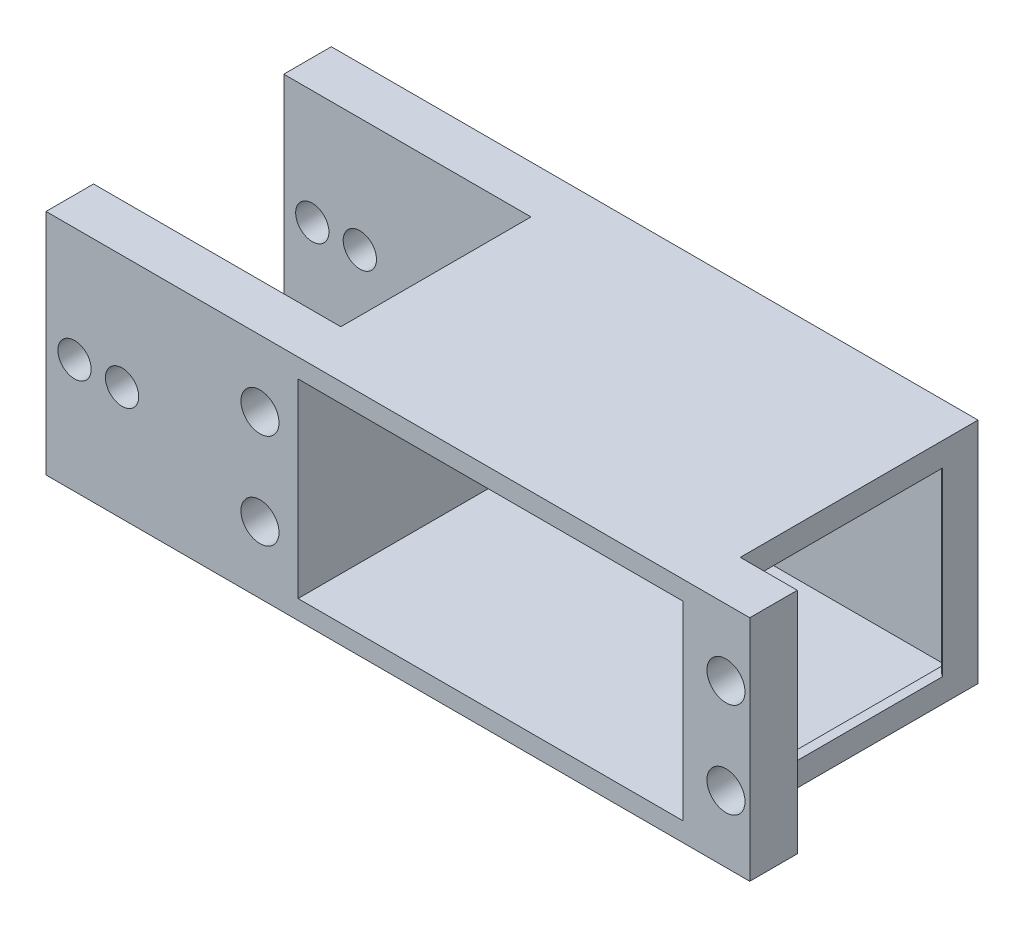
ISO-10303-21;
HEADER;
FILE_DESCRIPTION(('STEP AP214'),'2;1');
FILE_NAME('part.step','',(''),(''),'','','');
FILE_SCHEMA(('AUTOMOTIVE_DESIGN { 1 0 10303 214 1 1 1 1 }'));
ENDSEC;
DATA;
#1=APPLICATION_CONTEXT('core data for automotive mechanical design processes');
#2=APPLICATION_PROTOCOL_DEFINITION('international standard','automotive_design',2000,#1);
#3=PRODUCT_CONTEXT('',#1,'mechanical');
#4=PRODUCT('Part','Part','',(#3));
#5=PRODUCT_RELATED_PRODUCT_CATEGORY('part','',(#4));
#6=PRODUCT_DEFINITION_FORMATION('','',#4);
#7=PRODUCT_DEFINITION_CONTEXT('part definition',#1,'design');
#8=PRODUCT_DEFINITION('design','',#6,#7);
#9=PRODUCT_DEFINITION_SHAPE('','',#8);
#10=(LENGTH_UNIT() NAMED_UNIT(*) SI_UNIT(.MILLI.,.METRE.));
#11=(NAMED_UNIT(*) PLANE_ANGLE_UNIT() SI_UNIT($,.RADIAN.));
#12=(NAMED_UNIT(*) SI_UNIT($,.STERADIAN.) SOLID_ANGLE_UNIT());
#13=UNCERTAINTY_MEASURE_WITH_UNIT(LENGTH_MEASURE(1.E-05),#10,'distance_accuracy_value','');
#14=(GEOMETRIC_REPRESENTATION_CONTEXT(3) GLOBAL_UNCERTAINTY_ASSIGNED_CONTEXT((#13)) GLOBAL_UNIT_ASSIGNED_CONTEXT((#10,
#11,#12)) REPRESENTATION_CONTEXT('',''));
#15=CARTESIAN_POINT('',(0.,0.,0.));
#16=DIRECTION('',(0.,0.,1.));
#17=DIRECTION('',(1.,0.,0.));
#18=AXIS2_PLACEMENT_3D('',#15,#16,#17);
#19=CARTESIAN_POINT('',(-20.,0.,0.));
#20=DIRECTION('',(1.,0.,0.));
#21=DIRECTION('',(0.,0.,-1.));
#22=AXIS2_PLACEMENT_3D('',#19,#20,#21);
#23=PLANE('',#22);
#24=DIRECTION('',(0.,1.,0.));
#25=VECTOR('',#24,1.);
#26=CARTESIAN_POINT('',(-20.,-12.,5.));
#27=LINE('',#26,#25);
#28=CARTESIAN_POINT('',(-20.,-12.,5.));
#29=VERTEX_POINT('',#28);
#30=CARTESIAN_POINT('',(-20.,12.,5.));
#31=VERTEX_POINT('',#30);
#32=EDGE_CURVE('E65',#29,#31,#27,.T.);
#33=ORIENTED_EDGE('',*,*,#32,.F.);
#34=DIRECTION('',(0.,0.,1.));
#35=VECTOR('',#34,1.);
#36=CARTESIAN_POINT('',(-20.,-12.,25.));
#37=LINE('',#36,#35);
#38=CARTESIAN_POINT('',(-20.,-12.,25.));
#39=VERTEX_POINT('',#38);
#40=EDGE_CURVE('E238',#29,#39,#37,.T.);
#41=ORIENTED_EDGE('',*,*,#40,.T.);
#42=DIRECTION('',(0.,1.,0.));
#43=VECTOR('',#42,1.);
#44=CARTESIAN_POINT('',(-20.,12.,25.));
#45=LINE('',#44,#43);
#46=CARTESIAN_POINT('',(-20.,12.,25.));
#47=VERTEX_POINT('',#46);
#48=EDGE_CURVE('E241',#39,#47,#45,.T.);
#49=ORIENTED_EDGE('',*,*,#48,.T.);
#50=DIRECTION('',(0.,0.,-1.));
#51=VECTOR('',#50,1.);
#52=CARTESIAN_POINT('',(-20.,12.,0.));
#53=LINE('',#52,#51);
#54=EDGE_CURVE('E245',#47,#31,#53,.T.);
#55=ORIENTED_EDGE('',*,*,#54,.T.);
#56=EDGE_LOOP('',(#33,#41,#49,#55));
#57=FACE_BOUND('',#56,.T.);
#58=ADVANCED_FACE('F47',(#57),#23,.F.);
#59=CARTESIAN_POINT('',(0.,0.,30.));
#60=DIRECTION('',(0.,0.,-1.));
#61=DIRECTION('',(-1.,0.,0.));
#62=AXIS2_PLACEMENT_3D('',#59,#60,#61);
#63=PLANE('',#62);
#64=CARTESIAN_POINT('',(-43.,0.,30.));
#65=DIRECTION('',(0.,0.,1.));
#66=DIRECTION('',(1.,0.,0.));
#67=AXIS2_PLACEMENT_3D('',#64,#65,#66);
#68=CIRCLE('',#67,1.75);
#69=CARTESIAN_POINT('',(-41.25,0.,30.));
#70=VERTEX_POINT('',#69);
#71=EDGE_CURVE('E415',#70,#70,#68,.T.);
#72=ORIENTED_EDGE('',*,*,#71,.F.);
#73=EDGE_LOOP('',(#72));
#74=FACE_BOUND('',#73,.T.);
#75=CARTESIAN_POINT('',(-38.,0.,30.));
#76=DIRECTION('',(0.,0.,1.));
#77=DIRECTION('',(1.,0.,0.));
#78=AXIS2_PLACEMENT_3D('',#75,#76,#77);
#79=CIRCLE('',#78,1.75);
#80=CARTESIAN_POINT('',(-36.25,0.,30.));
#81=VERTEX_POINT('',#80);
#82=EDGE_CURVE('E421',#81,#81,#79,.T.);
#83=ORIENTED_EDGE('',*,*,#82,.F.);
#84=EDGE_LOOP('',(#83));
#85=FACE_BOUND('',#84,.T.);
#86=CARTESIAN_POINT('',(25.5,-5.,30.));
#87=DIRECTION('',(0.,0.,1.));
#88=DIRECTION('',(1.,0.,0.));
#89=AXIS2_PLACEMENT_3D('',#86,#87,#88);
#90=CIRCLE('',#89,2.);
#91=CARTESIAN_POINT('',(27.5,-5.,30.));
#92=VERTEX_POINT('',#91);
#93=EDGE_CURVE('E281',#92,#92,#90,.T.);
#94=ORIENTED_EDGE('',*,*,#93,.F.);
#95=EDGE_LOOP('',(#94));
#96=FACE_BOUND('',#95,.T.);
#97=CARTESIAN_POINT('',(25.5,5.,30.));
#98=DIRECTION('',(0.,0.,1.));
#99=DIRECTION('',(1.,0.,0.));
#100=AXIS2_PLACEMENT_3D('',#97,#98,#99);
#101=CIRCLE('',#100,2.0000000000033);
#102=CARTESIAN_POINT('',(27.5000000000033,5.,30.));
#103=VERTEX_POINT('',#102);
#104=EDGE_CURVE('E287',#103,#103,#101,.T.);
#105=ORIENTED_EDGE('',*,*,#104,.F.);
#106=EDGE_LOOP('',(#105));
#107=FACE_BOUND('',#106,.T.);
#108=CARTESIAN_POINT('',(-23.5,5.,30.));
#109=DIRECTION('',(0.,0.,1.));
#110=DIRECTION('',(1.,0.,0.));
#111=AXIS2_PLACEMENT_3D('',#108,#109,#110);
#112=CIRCLE('',#111,2.0000000000021);
#113=CARTESIAN_POINT('',(-21.4999999999979,5.,30.));
#114=VERTEX_POINT('',#113);
#115=EDGE_CURVE('E282',#114,#114,#112,.T.);
#116=ORIENTED_EDGE('',*,*,#115,.F.);
#117=EDGE_LOOP('',(#116));
#118=FACE_BOUND('',#117,.T.);
#119=CARTESIAN_POINT('',(-23.5,-5.,30.));
#120=DIRECTION('',(0.,0.,1.));
#121=DIRECTION('',(1.,0.,0.));
#122=AXIS2_PLACEMENT_3D('',#119,#120,#121);
#123=CIRCLE('',#122,2.);
#124=CARTESIAN_POINT('',(-21.5,-5.,30.));
#125=VERTEX_POINT('',#124);
#126=EDGE_CURVE('E286',#125,#125,#123,.T.);
#127=ORIENTED_EDGE('',*,*,#126,.F.);
#128=EDGE_LOOP('',(#127));
#129=FACE_BOUND('',#128,.T.);
#130=DIRECTION('',(-1.,0.,0.));
#131=VECTOR('',#130,1.);
#132=CARTESIAN_POINT('',(-28.,12.,30.));
#133=LINE('',#132,#131);
#134=CARTESIAN_POINT('',(28.,12.,30.));
#135=VERTEX_POINT('',#134);
#136=CARTESIAN_POINT('',(-46.,12.,30.));
#137=VERTEX_POINT('',#136);
#138=EDGE_CURVE('E362',#135,#137,#133,.T.);
#139=ORIENTED_EDGE('',*,*,#138,.T.);
#140=DIRECTION('',(0.,1.,0.));
#141=VECTOR('',#140,1.);
#142=CARTESIAN_POINT('',(-46.,12.,30.));
#143=LINE('',#142,#141);
#144=CARTESIAN_POINT('',(-46.,-12.,30.));
#145=VERTEX_POINT('',#144);
#146=EDGE_CURVE('E230',#145,#137,#143,.T.);
#147=ORIENTED_EDGE('',*,*,#146,.F.);
#148=DIRECTION('',(1.,0.,0.));
#149=VECTOR('',#148,1.);
#150=CARTESIAN_POINT('',(-28.,-12.,30.));
#151=LINE('',#150,#149);
#152=CARTESIAN_POINT('',(28.,-12.,30.));
#153=VERTEX_POINT('',#152);
#154=EDGE_CURVE('E365',#145,#153,#151,.T.);
#155=ORIENTED_EDGE('',*,*,#154,.T.);
#156=DIRECTION('',(0.,1.,0.));
#157=VECTOR('',#156,1.);
#158=CARTESIAN_POINT('',(28.,-12.,30.));
#159=LINE('',#158,#157);
#160=EDGE_CURVE('E358',#153,#135,#159,.T.);
#161=ORIENTED_EDGE('',*,*,#160,.T.);
#162=EDGE_LOOP('',(#139,#147,#155,#161));
#163=FACE_BOUND('',#162,.T.);
#164=DIRECTION('',(0.,1.,0.));
#165=VECTOR('',#164,1.);
#166=CARTESIAN_POINT('',(21.,0.,30.));
#167=LINE('',#166,#165);
#168=CARTESIAN_POINT('',(21.,-10.,30.));
#169=VERTEX_POINT('',#168);
#170=CARTESIAN_POINT('',(21.,10.,30.));
#171=VERTEX_POINT('',#170);
#172=EDGE_CURVE('E346',#169,#171,#167,.T.);
#173=ORIENTED_EDGE('',*,*,#172,.F.);
#174=DIRECTION('',(1.,0.,0.));
#175=VECTOR('',#174,1.);
#176=CARTESIAN_POINT('',(0.,-10.,30.));
#177=LINE('',#176,#175);
#178=CARTESIAN_POINT('',(-19.5,-10.,30.));
#179=VERTEX_POINT('',#178);
#180=EDGE_CURVE('E331',#179,#169,#177,.T.);
#181=ORIENTED_EDGE('',*,*,#180,.F.);
#182=DIRECTION('',(0.,-1.,0.));
#183=VECTOR('',#182,1.);
#184=CARTESIAN_POINT('',(-19.5,0.,30.));
#185=LINE('',#184,#183);
#186=CARTESIAN_POINT('',(-19.5,10.,30.));
#187=VERTEX_POINT('',#186);
#188=EDGE_CURVE('E352',#187,#179,#185,.T.);
#189=ORIENTED_EDGE('',*,*,#188,.F.);
#190=DIRECTION('',(-1.,0.,0.));
#191=VECTOR('',#190,1.);
#192=CARTESIAN_POINT('',(0.,10.,30.));
#193=LINE('',#192,#191);
#194=EDGE_CURVE('E349',#171,#187,#193,.T.);
#195=ORIENTED_EDGE('',*,*,#194,.F.);
#196=EDGE_LOOP('',(#173,#181,#189,#195));
#197=FACE_BOUND('',#196,.T.);
#198=ADVANCED_FACE('F452',(#74,#85,#96,#107,#118,#129,#163,#197),#63,.F.);
#199=CARTESIAN_POINT('',(28.,-12.,30.));
#200=DIRECTION('',(-1.,0.,0.));
#201=DIRECTION('',(0.,0.,1.));
#202=AXIS2_PLACEMENT_3D('',#199,#200,#201);
#203=PLANE('',#202);
#204=DIRECTION('',(0.,0.,-1.));
#205=VECTOR('',#204,1.);
#206=CARTESIAN_POINT('',(28.,-12.,30.));
#207=LINE('',#206,#205);
#208=CARTESIAN_POINT('',(28.,-12.,25.));
#209=VERTEX_POINT('',#208);
#210=EDGE_CURVE('E367',#153,#209,#207,.T.);
#211=ORIENTED_EDGE('',*,*,#210,.T.);
#212=DIRECTION('',(0.,-1.,0.));
#213=VECTOR('',#212,1.);
#214=CARTESIAN_POINT('',(28.,-12.,25.));
#215=LINE('',#214,#213);
#216=CARTESIAN_POINT('',(28.,12.,25.));
#217=VERTEX_POINT('',#216);
#218=EDGE_CURVE('E297',#217,#209,#215,.T.);
#219=ORIENTED_EDGE('',*,*,#218,.F.);
#220=DIRECTION('',(0.,0.,-1.));
#221=VECTOR('',#220,1.);
#222=CARTESIAN_POINT('',(28.,12.,30.));
#223=LINE('',#222,#221);
#224=EDGE_CURVE('E374',#135,#217,#223,.T.);
#225=ORIENTED_EDGE('',*,*,#224,.F.);
#226=ORIENTED_EDGE('',*,*,#160,.F.);
#227=EDGE_LOOP('',(#211,#219,#225,#226));
#228=FACE_BOUND('',#227,.T.);
#229=ADVANCED_FACE('F459',(#228),#203,.F.);
#230=CARTESIAN_POINT('',(-28.,12.,30.));
#231=DIRECTION('',(0.,-1.,0.));
#232=DIRECTION('',(0.,0.,-1.));
#233=AXIS2_PLACEMENT_3D('',#230,#231,#232);
#234=PLANE('',#233);
#235=ORIENTED_EDGE('',*,*,#54,.F.);
#236=DIRECTION('',(-1.,0.,0.));
#237=VECTOR('',#236,1.);
#238=CARTESIAN_POINT('',(-20.,12.,25.));
#239=LINE('',#238,#237);
#240=CARTESIAN_POINT('',(-46.,12.,25.));
#241=VERTEX_POINT('',#240);
#242=EDGE_CURVE('E249',#47,#241,#239,.T.);
#243=ORIENTED_EDGE('',*,*,#242,.T.);
#244=DIRECTION('',(0.,0.,-1.));
#245=VECTOR('',#244,1.);
#246=CARTESIAN_POINT('',(-46.,12.,25.));
#247=LINE('',#246,#245);
#248=EDGE_CURVE('E234',#137,#241,#247,.T.);
#249=ORIENTED_EDGE('',*,*,#248,.F.);
#250=ORIENTED_EDGE('',*,*,#138,.F.);
#251=ORIENTED_EDGE('',*,*,#224,.T.);
#252=DIRECTION('',(1.,0.,0.));
#253=VECTOR('',#252,1.);
#254=CARTESIAN_POINT('',(24.,12.,25.));
#255=LINE('',#254,#253);
#256=CARTESIAN_POINT('',(22.,12.,25.));
#257=VERTEX_POINT('',#256);
#258=EDGE_CURVE('E300',#257,#217,#255,.T.);
#259=ORIENTED_EDGE('',*,*,#258,.F.);
#260=DIRECTION('',(0.,0.,1.));
#261=VECTOR('',#260,1.);
#262=CARTESIAN_POINT('',(22.,12.,25.));
#263=LINE('',#262,#261);
#264=CARTESIAN_POINT('',(22.,12.,0.));
#265=VERTEX_POINT('',#264);
#266=EDGE_CURVE('E184',#265,#257,#263,.T.);
#267=ORIENTED_EDGE('',*,*,#266,.F.);
#268=DIRECTION('',(-1.,0.,0.));
#269=VECTOR('',#268,1.);
#270=CARTESIAN_POINT('',(-28.,12.,0.));
#271=LINE('',#270,#269);
#272=CARTESIAN_POINT('',(-46.,12.,0.));
#273=VERTEX_POINT('',#272);
#274=EDGE_CURVE('E176',#265,#273,#271,.T.);
#275=ORIENTED_EDGE('',*,*,#274,.T.);
#276=DIRECTION('',(0.,0.,-1.));
#277=VECTOR('',#276,1.);
#278=CARTESIAN_POINT('',(-46.,12.,5.));
#279=LINE('',#278,#277);
#280=CARTESIAN_POINT('',(-46.,12.,5.));
#281=VERTEX_POINT('',#280);
#282=EDGE_CURVE('E182',#281,#273,#279,.T.);
#283=ORIENTED_EDGE('',*,*,#282,.F.);
#284=DIRECTION('',(1.,0.,0.));
#285=VECTOR('',#284,1.);
#286=CARTESIAN_POINT('',(-46.,12.,5.));
#287=LINE('',#286,#285);
#288=EDGE_CURVE('E214',#281,#31,#287,.T.);
#289=ORIENTED_EDGE('',*,*,#288,.T.);
#290=EDGE_LOOP('',(#235,#243,#249,#250,#251,#259,#267,#275,#283,#289));
#291=FACE_BOUND('',#290,.T.);
#292=ADVANCED_FACE('F179',(#291),#234,.F.);
#293=CARTESIAN_POINT('',(-28.,-12.,30.));
#294=DIRECTION('',(0.,1.,0.));
#295=DIRECTION('',(0.,0.,1.));
#296=AXIS2_PLACEMENT_3D('',#293,#294,#295);
#297=PLANE('',#296);
#298=ORIENTED_EDGE('',*,*,#154,.F.);
#299=DIRECTION('',(0.,0.,1.));
#300=VECTOR('',#299,1.);
#301=CARTESIAN_POINT('',(-46.,-12.,30.));
#302=LINE('',#301,#300);
#303=CARTESIAN_POINT('',(-46.,-12.,25.));
#304=VERTEX_POINT('',#303);
#305=EDGE_CURVE('E226',#304,#145,#302,.T.);
#306=ORIENTED_EDGE('',*,*,#305,.F.);
#307=DIRECTION('',(-1.,0.,0.));
#308=VECTOR('',#307,1.);
#309=CARTESIAN_POINT('',(-20.,-12.,25.));
#310=LINE('',#309,#308);
#311=EDGE_CURVE('E248',#39,#304,#310,.T.);
#312=ORIENTED_EDGE('',*,*,#311,.F.);
#313=ORIENTED_EDGE('',*,*,#40,.F.);
#314=DIRECTION('',(1.,0.,0.));
#315=VECTOR('',#314,1.);
#316=CARTESIAN_POINT('',(-46.,-12.,5.));
#317=LINE('',#316,#315);
#318=CARTESIAN_POINT('',(-46.,-12.,5.));
#319=VERTEX_POINT('',#318);
#320=EDGE_CURVE('E218',#319,#29,#317,.T.);
#321=ORIENTED_EDGE('',*,*,#320,.F.);
#322=DIRECTION('',(0.,0.,1.));
#323=VECTOR('',#322,1.);
#324=CARTESIAN_POINT('',(-46.,-12.,0.));
#325=LINE('',#324,#323);
#326=CARTESIAN_POINT('',(-46.,-12.,0.));
#327=VERTEX_POINT('',#326);
#328=EDGE_CURVE('E197',#327,#319,#325,.T.);
#329=ORIENTED_EDGE('',*,*,#328,.F.);
#330=DIRECTION('',(1.,0.,0.));
#331=VECTOR('',#330,1.);
#332=CARTESIAN_POINT('',(-28.,-12.,0.));
#333=LINE('',#332,#331);
#334=CARTESIAN_POINT('',(22.,-12.,0.));
#335=VERTEX_POINT('',#334);
#336=EDGE_CURVE('E188',#327,#335,#333,.T.);
#337=ORIENTED_EDGE('',*,*,#336,.T.);
#338=DIRECTION('',(0.,0.,-1.));
#339=VECTOR('',#338,1.);
#340=CARTESIAN_POINT('',(22.,-12.,0.));
#341=LINE('',#340,#339);
#342=CARTESIAN_POINT('',(22.,-12.,25.));
#343=VERTEX_POINT('',#342);
#344=EDGE_CURVE('E270',#343,#335,#341,.T.);
#345=ORIENTED_EDGE('',*,*,#344,.F.);
#346=DIRECTION('',(1.,0.,0.));
#347=VECTOR('',#346,1.);
#348=CARTESIAN_POINT('',(24.,-12.,25.));
#349=LINE('',#348,#347);
#350=EDGE_CURVE('E301',#343,#209,#349,.T.);
#351=ORIENTED_EDGE('',*,*,#350,.T.);
#352=ORIENTED_EDGE('',*,*,#210,.F.);
#353=EDGE_LOOP('',(#298,#306,#312,#313,#321,#329,#337,#345,#351,#352));
#354=FACE_BOUND('',#353,.T.);
#355=ADVANCED_FACE('F528',(#354),#297,.F.);
#356=CARTESIAN_POINT('',(0.,0.,0.));
#357=DIRECTION('',(0.,0.,-1.));
#358=DIRECTION('',(-1.,0.,0.));
#359=AXIS2_PLACEMENT_3D('',#356,#357,#358);
#360=PLANE('',#359);
#361=CARTESIAN_POINT('',(-43.,0.,0.));
#362=DIRECTION('',(0.,0.,1.));
#363=DIRECTION('',(1.,0.,0.));
#364=AXIS2_PLACEMENT_3D('',#361,#362,#363);
#365=CIRCLE('',#364,1.75);
#366=CARTESIAN_POINT('',(-41.25,0.,0.));
#367=VERTEX_POINT('',#366);
#368=EDGE_CURVE('E408',#367,#367,#365,.T.);
#369=ORIENTED_EDGE('',*,*,#368,.T.);
#370=EDGE_LOOP('',(#369));
#371=FACE_BOUND('',#370,.T.);
#372=CARTESIAN_POINT('',(-38.,0.,0.));
#373=DIRECTION('',(0.,0.,1.));
#374=DIRECTION('',(1.,0.,0.));
#375=AXIS2_PLACEMENT_3D('',#372,#373,#374);
#376=CIRCLE('',#375,1.75);
#377=CARTESIAN_POINT('',(-36.25,0.,0.));
#378=VERTEX_POINT('',#377);
#379=EDGE_CURVE('E427',#378,#378,#376,.T.);
#380=ORIENTED_EDGE('',*,*,#379,.T.);
#381=EDGE_LOOP('',(#380));
#382=FACE_BOUND('',#381,.T.);
#383=ORIENTED_EDGE('',*,*,#336,.F.);
#384=DIRECTION('',(0.,-1.,0.));
#385=VECTOR('',#384,1.);
#386=CARTESIAN_POINT('',(-46.,12.,0.));
#387=LINE('',#386,#385);
#388=EDGE_CURVE('E192',#273,#327,#387,.T.);
#389=ORIENTED_EDGE('',*,*,#388,.F.);
#390=ORIENTED_EDGE('',*,*,#274,.F.);
#391=DIRECTION('',(0.,1.,0.));
#392=VECTOR('',#391,1.);
#393=CARTESIAN_POINT('',(22.,12.,0.));
#394=LINE('',#393,#392);
#395=EDGE_CURVE('E274',#335,#265,#394,.T.);
#396=ORIENTED_EDGE('',*,*,#395,.F.);
#397=EDGE_LOOP('',(#383,#389,#390,#396));
#398=FACE_BOUND('',#397,.T.);
#399=ADVANCED_FACE('F193',(#371,#382,#398),#360,.T.);
#400=CARTESIAN_POINT('',(21.,-12.,30.));
#401=DIRECTION('',(-1.,0.,0.));
#402=DIRECTION('',(0.,0.,1.));
#403=AXIS2_PLACEMENT_3D('',#400,#401,#402);
#404=PLANE('',#403);
#405=DIRECTION('',(0.,0.,1.));
#406=VECTOR('',#405,1.);
#407=CARTESIAN_POINT('',(21.,-9.5,30.));
#408=LINE('',#407,#406);
#409=CARTESIAN_POINT('',(21.,-9.5,2.));
#410=VERTEX_POINT('',#409);
#411=CARTESIAN_POINT('',(21.,-9.5,24.));
#412=VERTEX_POINT('',#411);
#413=EDGE_CURVE('E385',#410,#412,#408,.T.);
#414=ORIENTED_EDGE('',*,*,#413,.F.);
#415=DIRECTION('',(0.,1.,0.));
#416=VECTOR('',#415,1.);
#417=CARTESIAN_POINT('',(21.,0.,2.));
#418=LINE('',#417,#416);
#419=CARTESIAN_POINT('',(21.,-10.,2.));
#420=VERTEX_POINT('',#419);
#421=EDGE_CURVE('E316',#420,#410,#418,.T.);
#422=ORIENTED_EDGE('',*,*,#421,.F.);
#423=DIRECTION('',(0.,0.,-1.));
#424=VECTOR('',#423,1.);
#425=CARTESIAN_POINT('',(21.,-10.,30.));
#426=LINE('',#425,#424);
#427=EDGE_CURVE('E326',#169,#420,#426,.T.);
#428=ORIENTED_EDGE('',*,*,#427,.F.);
#429=ORIENTED_EDGE('',*,*,#172,.T.);
#430=DIRECTION('',(0.,0.,-1.));
#431=VECTOR('',#430,1.);
#432=CARTESIAN_POINT('',(21.,10.,30.));
#433=LINE('',#432,#431);
#434=CARTESIAN_POINT('',(21.,10.,2.));
#435=VERTEX_POINT('',#434);
#436=EDGE_CURVE('E189',#171,#435,#433,.T.);
#437=ORIENTED_EDGE('',*,*,#436,.T.);
#438=CARTESIAN_POINT('',(21.,9.49999999999999,2.));
#439=VERTEX_POINT('',#438);
#440=EDGE_CURVE('E312',#439,#435,#418,.T.);
#441=ORIENTED_EDGE('',*,*,#440,.F.);
#442=DIRECTION('',(0.,0.,-1.));
#443=VECTOR('',#442,1.);
#444=CARTESIAN_POINT('',(21.,9.5,30.));
#445=LINE('',#444,#443);
#446=CARTESIAN_POINT('',(21.,9.5,24.));
#447=VERTEX_POINT('',#446);
#448=EDGE_CURVE('E378',#447,#439,#445,.T.);
#449=ORIENTED_EDGE('',*,*,#448,.F.);
#450=DIRECTION('',(0.,1.,0.));
#451=VECTOR('',#450,1.);
#452=CARTESIAN_POINT('',(21.,-12.,24.));
#453=LINE('',#452,#451);
#454=EDGE_CURVE('E381',#412,#447,#453,.T.);
#455=ORIENTED_EDGE('',*,*,#454,.F.);
#456=EDGE_LOOP('',(#414,#422,#428,#429,#437,#441,#449,#455));
#457=FACE_BOUND('',#456,.T.);
#458=ADVANCED_FACE('F507',(#457),#404,.T.);
#459=CARTESIAN_POINT('',(-28.,10.,30.));
#460=DIRECTION('',(0.,-1.,0.));
#461=DIRECTION('',(0.,0.,-1.));
#462=AXIS2_PLACEMENT_3D('',#459,#460,#461);
#463=PLANE('',#462);
#464=DIRECTION('',(-1.,0.,0.));
#465=VECTOR('',#464,1.);
#466=CARTESIAN_POINT('',(0.,10.,2.));
#467=LINE('',#466,#465);
#468=CARTESIAN_POINT('',(-19.5,10.,2.));
#469=VERTEX_POINT('',#468);
#470=EDGE_CURVE('E320',#435,#469,#467,.T.);
#471=ORIENTED_EDGE('',*,*,#470,.F.);
#472=ORIENTED_EDGE('',*,*,#436,.F.);
#473=ORIENTED_EDGE('',*,*,#194,.T.);
#474=DIRECTION('',(0.,0.,-1.));
#475=VECTOR('',#474,1.);
#476=CARTESIAN_POINT('',(-19.5,10.,30.));
#477=LINE('',#476,#475);
#478=EDGE_CURVE('E325',#187,#469,#477,.T.);
#479=ORIENTED_EDGE('',*,*,#478,.T.);
#480=EDGE_LOOP('',(#471,#472,#473,#479));
#481=FACE_BOUND('',#480,.T.);
#482=ADVANCED_FACE('F510',(#481),#463,.T.);
#483=CARTESIAN_POINT('',(-19.5,-12.,30.));
#484=DIRECTION('',(1.,0.,0.));
#485=DIRECTION('',(0.,0.,-1.));
#486=AXIS2_PLACEMENT_3D('',#483,#484,#485);
#487=PLANE('',#486);
#488=DIRECTION('',(0.,-1.,0.));
#489=VECTOR('',#488,1.);
#490=CARTESIAN_POINT('',(-19.5,0.,2.));
#491=LINE('',#490,#489);
#492=CARTESIAN_POINT('',(-19.5,-10.,2.));
#493=VERTEX_POINT('',#492);
#494=EDGE_CURVE('E334',#469,#493,#491,.T.);
#495=ORIENTED_EDGE('',*,*,#494,.F.);
#496=ORIENTED_EDGE('',*,*,#478,.F.);
#497=ORIENTED_EDGE('',*,*,#188,.T.);
#498=DIRECTION('',(0.,0.,-1.));
#499=VECTOR('',#498,1.);
#500=CARTESIAN_POINT('',(-19.5,-10.,30.));
#501=LINE('',#500,#499);
#502=EDGE_CURVE('E330',#179,#493,#501,.T.);
#503=ORIENTED_EDGE('',*,*,#502,.T.);
#504=EDGE_LOOP('',(#495,#496,#497,#503));
#505=FACE_BOUND('',#504,.T.);
#506=ADVANCED_FACE('F514',(#505),#487,.T.);
#507=CARTESIAN_POINT('',(-28.,-10.,30.));
#508=DIRECTION('',(0.,1.,0.));
#509=DIRECTION('',(0.,0.,1.));
#510=AXIS2_PLACEMENT_3D('',#507,#508,#509);
#511=PLANE('',#510);
#512=DIRECTION('',(1.,0.,0.));
#513=VECTOR('',#512,1.);
#514=CARTESIAN_POINT('',(0.,-10.,2.));
#515=LINE('',#514,#513);
#516=EDGE_CURVE('E340',#493,#420,#515,.T.);
#517=ORIENTED_EDGE('',*,*,#516,.F.);
#518=ORIENTED_EDGE('',*,*,#502,.F.);
#519=ORIENTED_EDGE('',*,*,#180,.T.);
#520=ORIENTED_EDGE('',*,*,#427,.T.);
#521=EDGE_LOOP('',(#517,#518,#519,#520));
#522=FACE_BOUND('',#521,.T.);
#523=ADVANCED_FACE('F518',(#522),#511,.T.);
#524=CARTESIAN_POINT('',(0.,0.,2.));
#525=DIRECTION('',(0.,0.,-1.));
#526=DIRECTION('',(-1.,0.,0.));
#527=AXIS2_PLACEMENT_3D('',#524,#525,#526);
#528=PLANE('',#527);
#529=ORIENTED_EDGE('',*,*,#421,.T.);
#530=EDGE_CURVE('E321',#410,#439,#418,.T.);
#531=ORIENTED_EDGE('',*,*,#530,.T.);
#532=ORIENTED_EDGE('',*,*,#440,.T.);
#533=ORIENTED_EDGE('',*,*,#470,.T.);
#534=ORIENTED_EDGE('',*,*,#494,.T.);
#535=ORIENTED_EDGE('',*,*,#516,.T.);
#536=EDGE_LOOP('',(#529,#531,#532,#533,#534,#535));
#537=FACE_BOUND('',#536,.T.);
#538=ADVANCED_FACE('F498',(#537),#528,.F.);
#539=CARTESIAN_POINT('',(18.,-9.5,24.));
#540=DIRECTION('',(0.,-1.,0.));
#541=DIRECTION('',(0.,0.,-1.));
#542=AXIS2_PLACEMENT_3D('',#539,#540,#541);
#543=PLANE('',#542);
#544=DIRECTION('',(1.,0.,0.));
#545=VECTOR('',#544,1.);
#546=CARTESIAN_POINT('',(18.,-9.5,24.));
#547=LINE('',#546,#545);
#548=CARTESIAN_POINT('',(22.,-9.5,24.));
#549=VERTEX_POINT('',#548);
#550=EDGE_CURVE('E308',#412,#549,#547,.T.);
#551=ORIENTED_EDGE('',*,*,#550,.T.);
#552=DIRECTION('',(0.,0.,-1.));
#553=VECTOR('',#552,1.);
#554=CARTESIAN_POINT('',(22.,-9.5,24.));
#555=LINE('',#554,#553);
#556=CARTESIAN_POINT('',(22.,-9.5,3.73205080756888));
#557=VERTEX_POINT('',#556);
#558=EDGE_CURVE('E263',#549,#557,#555,.T.);
#559=ORIENTED_EDGE('',*,*,#558,.T.);
#560=CARTESIAN_POINT('',(23.,-9.5,2.));
#561=DIRECTION('',(0.,-1.,0.));
#562=DIRECTION('',(0.,0.,-1.));
#563=AXIS2_PLACEMENT_3D('',#560,#561,#562);
#564=CIRCLE('',#563,2.);
#565=EDGE_CURVE('E388',#557,#410,#564,.T.);
#566=ORIENTED_EDGE('',*,*,#565,.T.);
#567=ORIENTED_EDGE('',*,*,#413,.T.);
#568=EDGE_LOOP('',(#551,#559,#566,#567));
#569=FACE_BOUND('',#568,.T.);
#570=ADVANCED_FACE('F494',(#569),#543,.F.);
#571=CARTESIAN_POINT('',(18.,9.5,24.));
#572=DIRECTION('',(0.,0.,1.));
#573=DIRECTION('',(1.,0.,0.));
#574=AXIS2_PLACEMENT_3D('',#571,#572,#573);
#575=PLANE('',#574);
#576=DIRECTION('',(1.,0.,0.));
#577=VECTOR('',#576,1.);
#578=CARTESIAN_POINT('',(18.,9.5,24.));
#579=LINE('',#578,#577);
#580=CARTESIAN_POINT('',(22.,9.5,24.));
#581=VERTEX_POINT('',#580);
#582=EDGE_CURVE('E305',#447,#581,#579,.T.);
#583=ORIENTED_EDGE('',*,*,#582,.T.);
#584=DIRECTION('',(0.,-1.,0.));
#585=VECTOR('',#584,1.);
#586=CARTESIAN_POINT('',(22.,6.32287565553728,24.));
#587=LINE('',#586,#585);
#588=EDGE_CURVE('E259',#581,#549,#587,.T.);
#589=ORIENTED_EDGE('',*,*,#588,.T.);
#590=ORIENTED_EDGE('',*,*,#550,.F.);
#591=ORIENTED_EDGE('',*,*,#454,.T.);
#592=EDGE_LOOP('',(#583,#589,#590,#591));
#593=FACE_BOUND('',#592,.T.);
#594=ADVANCED_FACE('F497',(#593),#575,.F.);
#595=CARTESIAN_POINT('',(18.,9.5,24.));
#596=DIRECTION('',(0.,1.,0.));
#597=DIRECTION('',(0.,0.,1.));
#598=AXIS2_PLACEMENT_3D('',#595,#596,#597);
#599=PLANE('',#598);
#600=CARTESIAN_POINT('',(23.,9.5,2.));
#601=DIRECTION('',(0.,1.,0.));
#602=DIRECTION('',(0.,0.,1.));
#603=AXIS2_PLACEMENT_3D('',#600,#601,#602);
#604=CIRCLE('',#603,2.);
#605=CARTESIAN_POINT('',(22.,9.5,3.73205080756888));
#606=VERTEX_POINT('',#605);
#607=EDGE_CURVE('E391',#439,#606,#604,.T.);
#608=ORIENTED_EDGE('',*,*,#607,.T.);
#609=DIRECTION('',(0.,0.,1.));
#610=VECTOR('',#609,1.);
#611=CARTESIAN_POINT('',(22.,9.5,24.));
#612=LINE('',#611,#610);
#613=EDGE_CURVE('E72',#606,#581,#612,.T.);
#614=ORIENTED_EDGE('',*,*,#613,.T.);
#615=ORIENTED_EDGE('',*,*,#582,.F.);
#616=ORIENTED_EDGE('',*,*,#448,.T.);
#617=EDGE_LOOP('',(#608,#614,#615,#616));
#618=FACE_BOUND('',#617,.T.);
#619=ADVANCED_FACE('F502',(#618),#599,.F.);
#620=CARTESIAN_POINT('',(23.,9.5,2.));
#621=DIRECTION('',(0.,1.,0.));
#622=DIRECTION('',(0.,0.,1.));
#623=AXIS2_PLACEMENT_3D('',#620,#621,#622);
#624=CYLINDRICAL_SURFACE('',#623,2.);
#625=DIRECTION('',(0.,1.,0.));
#626=VECTOR('',#625,1.);
#627=CARTESIAN_POINT('',(22.,9.5,3.73205080756888));
#628=LINE('',#627,#626);
#629=EDGE_CURVE('E11',#606,#557,#628,.F.);
#630=ORIENTED_EDGE('',*,*,#629,.F.);
#631=ORIENTED_EDGE('',*,*,#607,.F.);
#632=ORIENTED_EDGE('',*,*,#530,.F.);
#633=ORIENTED_EDGE('',*,*,#565,.F.);
#634=EDGE_LOOP('',(#630,#631,#632,#633));
#635=FACE_BOUND('',#634,.T.);
#636=ADVANCED_FACE('F49',(#635),#624,.T.);
#637=CARTESIAN_POINT('',(24.,-12.,25.));
#638=DIRECTION('',(0.,0.,1.));
#639=DIRECTION('',(1.,0.,0.));
#640=AXIS2_PLACEMENT_3D('',#637,#638,#639);
#641=PLANE('',#640);
#642=CARTESIAN_POINT('',(25.5,5.,25.));
#643=DIRECTION('',(0.,0.,1.));
#644=DIRECTION('',(1.,0.,0.));
#645=AXIS2_PLACEMENT_3D('',#642,#643,#644);
#646=CIRCLE('',#645,2.0000000000033);
#647=CARTESIAN_POINT('',(27.5000000000033,5.,25.));
#648=VERTEX_POINT('',#647);
#649=EDGE_CURVE('E395',#648,#648,#646,.T.);
#650=ORIENTED_EDGE('',*,*,#649,.T.);
#651=EDGE_LOOP('',(#650));
#652=FACE_BOUND('',#651,.T.);
#653=CARTESIAN_POINT('',(25.5,-5.,25.));
#654=DIRECTION('',(0.,0.,1.));
#655=DIRECTION('',(1.,0.,0.));
#656=AXIS2_PLACEMENT_3D('',#653,#654,#655);
#657=CIRCLE('',#656,2.);
#658=CARTESIAN_POINT('',(27.5,-5.,25.));
#659=VERTEX_POINT('',#658);
#660=EDGE_CURVE('E57',#659,#659,#657,.T.);
#661=ORIENTED_EDGE('',*,*,#660,.T.);
#662=EDGE_LOOP('',(#661));
#663=FACE_BOUND('',#662,.T.);
#664=ORIENTED_EDGE('',*,*,#350,.F.);
#665=DIRECTION('',(0.,-1.,0.));
#666=VECTOR('',#665,1.);
#667=CARTESIAN_POINT('',(22.,6.32287565553728,25.));
#668=LINE('',#667,#666);
#669=EDGE_CURVE('E266',#257,#343,#668,.T.);
#670=ORIENTED_EDGE('',*,*,#669,.F.);
#671=ORIENTED_EDGE('',*,*,#258,.T.);
#672=ORIENTED_EDGE('',*,*,#218,.T.);
#673=EDGE_LOOP('',(#664,#670,#671,#672));
#674=FACE_BOUND('',#673,.T.);
#675=ADVANCED_FACE('F483',(#652,#663,#674),#641,.F.);
#676=CARTESIAN_POINT('',(25.5,5.,17.));
#677=DIRECTION('',(0.,0.,1.));
#678=DIRECTION('',(1.,0.,0.));
#679=AXIS2_PLACEMENT_3D('',#676,#677,#678);
#680=CYLINDRICAL_SURFACE('',#679,2.0000000000033);
#681=ORIENTED_EDGE('',*,*,#104,.T.);
#682=EDGE_LOOP('',(#681));
#683=FACE_BOUND('',#682,.T.);
#684=ORIENTED_EDGE('',*,*,#649,.F.);
#685=EDGE_LOOP('',(#684));
#686=FACE_BOUND('',#685,.T.);
#687=ADVANCED_FACE('F479',(#683,#686),#680,.F.);
#688=CARTESIAN_POINT('',(25.5,-5.,17.));
#689=DIRECTION('',(0.,0.,1.));
#690=DIRECTION('',(1.,0.,0.));
#691=AXIS2_PLACEMENT_3D('',#688,#689,#690);
#692=CYLINDRICAL_SURFACE('',#691,2.);
#693=ORIENTED_EDGE('',*,*,#93,.T.);
#694=EDGE_LOOP('',(#693));
#695=FACE_BOUND('',#694,.T.);
#696=ORIENTED_EDGE('',*,*,#660,.F.);
#697=EDGE_LOOP('',(#696));
#698=FACE_BOUND('',#697,.T.);
#699=ADVANCED_FACE('F482',(#695,#698),#692,.F.);
#700=CARTESIAN_POINT('',(-23.5,-5.,17.));
#701=DIRECTION('',(0.,0.,1.));
#702=DIRECTION('',(1.,0.,0.));
#703=AXIS2_PLACEMENT_3D('',#700,#701,#702);
#704=CYLINDRICAL_SURFACE('',#703,2.);
#705=CARTESIAN_POINT('',(-23.5,-5.,25.));
#706=DIRECTION('',(0.,0.,1.));
#707=DIRECTION('',(0.,-1.,0.));
#708=AXIS2_PLACEMENT_3D('',#705,#706,#707);
#709=CIRCLE('',#708,2.);
#710=CARTESIAN_POINT('',(-23.5,-7.,25.));
#711=VERTEX_POINT('',#710);
#712=EDGE_CURVE('E255',#711,#711,#709,.F.);
#713=ORIENTED_EDGE('',*,*,#712,.T.);
#714=EDGE_LOOP('',(#713));
#715=FACE_BOUND('',#714,.T.);
#716=ORIENTED_EDGE('',*,*,#126,.T.);
#717=EDGE_LOOP('',(#716));
#718=FACE_BOUND('',#717,.T.);
#719=ADVANCED_FACE('F477',(#715,#718),#704,.F.);
#720=CARTESIAN_POINT('',(-23.5,5.,17.));
#721=DIRECTION('',(0.,0.,1.));
#722=DIRECTION('',(1.,0.,0.));
#723=AXIS2_PLACEMENT_3D('',#720,#721,#722);
#724=CYLINDRICAL_SURFACE('',#723,2.0000000000021);
#725=CARTESIAN_POINT('',(-23.5,5.,25.));
#726=DIRECTION('',(0.,0.,1.));
#727=DIRECTION('',(0.,-1.,0.));
#728=AXIS2_PLACEMENT_3D('',#725,#726,#727);
#729=CIRCLE('',#728,2.0000000000021);
#730=CARTESIAN_POINT('',(-23.5,2.9999999999979,25.));
#731=VERTEX_POINT('',#730);
#732=EDGE_CURVE('E252',#731,#731,#729,.F.);
#733=ORIENTED_EDGE('',*,*,#732,.T.);
#734=EDGE_LOOP('',(#733));
#735=FACE_BOUND('',#734,.T.);
#736=ORIENTED_EDGE('',*,*,#115,.T.);
#737=EDGE_LOOP('',(#736));
#738=FACE_BOUND('',#737,.T.);
#739=ADVANCED_FACE('F473',(#735,#738),#724,.F.);
#740=CARTESIAN_POINT('',(22.,0.,0.));
#741=DIRECTION('',(-1.,0.,0.));
#742=DIRECTION('',(0.,0.,1.));
#743=AXIS2_PLACEMENT_3D('',#740,#741,#742);
#744=PLANE('',#743);
#745=ORIENTED_EDGE('',*,*,#669,.T.);
#746=ORIENTED_EDGE('',*,*,#344,.T.);
#747=ORIENTED_EDGE('',*,*,#395,.T.);
#748=ORIENTED_EDGE('',*,*,#266,.T.);
#749=EDGE_LOOP('',(#745,#746,#747,#748));
#750=FACE_BOUND('',#749,.T.);
#751=ORIENTED_EDGE('',*,*,#558,.F.);
#752=ORIENTED_EDGE('',*,*,#588,.F.);
#753=ORIENTED_EDGE('',*,*,#613,.F.);
#754=ORIENTED_EDGE('',*,*,#629,.T.);
#755=EDGE_LOOP('',(#751,#752,#753,#754));
#756=FACE_BOUND('',#755,.T.);
#757=ADVANCED_FACE('F469',(#750,#756),#744,.F.);
#758=CARTESIAN_POINT('',(-20.,12.,25.));
#759=DIRECTION('',(0.,0.,1.));
#760=DIRECTION('',(0.,-1.,0.));
#761=AXIS2_PLACEMENT_3D('',#758,#759,#760);
#762=PLANE('',#761);
#763=CARTESIAN_POINT('',(-43.,0.,25.));
#764=DIRECTION('',(0.,0.,1.));
#765=DIRECTION('',(0.,-1.,0.));
#766=AXIS2_PLACEMENT_3D('',#763,#764,#765);
#767=CIRCLE('',#766,1.75);
#768=CARTESIAN_POINT('',(-43.,-1.75,25.));
#769=VERTEX_POINT('',#768);
#770=EDGE_CURVE('E206',#769,#769,#767,.T.);
#771=ORIENTED_EDGE('',*,*,#770,.T.);
#772=EDGE_LOOP('',(#771));
#773=FACE_BOUND('',#772,.T.);
#774=CARTESIAN_POINT('',(-38.,0.,25.));
#775=DIRECTION('',(0.,0.,1.));
#776=DIRECTION('',(0.,-1.,0.));
#777=AXIS2_PLACEMENT_3D('',#774,#775,#776);
#778=CIRCLE('',#777,1.75);
#779=CARTESIAN_POINT('',(-38.,-1.75,25.));
#780=VERTEX_POINT('',#779);
#781=EDGE_CURVE('E407',#780,#780,#778,.T.);
#782=ORIENTED_EDGE('',*,*,#781,.T.);
#783=EDGE_LOOP('',(#782));
#784=FACE_BOUND('',#783,.T.);
#785=ORIENTED_EDGE('',*,*,#732,.F.);
#786=EDGE_LOOP('',(#785));
#787=FACE_BOUND('',#786,.T.);
#788=ORIENTED_EDGE('',*,*,#311,.T.);
#789=DIRECTION('',(0.,-1.,0.));
#790=VECTOR('',#789,1.);
#791=CARTESIAN_POINT('',(-46.,-12.,25.));
#792=LINE('',#791,#790);
#793=EDGE_CURVE('E222',#241,#304,#792,.T.);
#794=ORIENTED_EDGE('',*,*,#793,.F.);
#795=ORIENTED_EDGE('',*,*,#242,.F.);
#796=ORIENTED_EDGE('',*,*,#48,.F.);
#797=EDGE_LOOP('',(#788,#794,#795,#796));
#798=FACE_BOUND('',#797,.T.);
#799=ORIENTED_EDGE('',*,*,#712,.F.);
#800=EDGE_LOOP('',(#799));
#801=FACE_BOUND('',#800,.T.);
#802=ADVANCED_FACE('F466',(#773,#784,#787,#798,#801),#762,.F.);
#803=CARTESIAN_POINT('',(-46.,0.,0.));
#804=DIRECTION('',(1.,0.,0.));
#805=DIRECTION('',(0.,0.,-1.));
#806=AXIS2_PLACEMENT_3D('',#803,#804,#805);
#807=PLANE('',#806);
#808=ORIENTED_EDGE('',*,*,#793,.T.);
#809=ORIENTED_EDGE('',*,*,#305,.T.);
#810=ORIENTED_EDGE('',*,*,#146,.T.);
#811=ORIENTED_EDGE('',*,*,#248,.T.);
#812=EDGE_LOOP('',(#808,#809,#810,#811));
#813=FACE_BOUND('',#812,.T.);
#814=ADVANCED_FACE('F464',(#813),#807,.F.);
#815=CARTESIAN_POINT('',(-46.,-12.,5.));
#816=DIRECTION('',(0.,0.,-1.));
#817=DIRECTION('',(0.,1.,0.));
#818=AXIS2_PLACEMENT_3D('',#815,#816,#817);
#819=PLANE('',#818);
#820=CARTESIAN_POINT('',(-43.,0.,5.));
#821=DIRECTION('',(0.,0.,-1.));
#822=DIRECTION('',(0.,1.,0.));
#823=AXIS2_PLACEMENT_3D('',#820,#821,#822);
#824=CIRCLE('',#823,1.75);
#825=CARTESIAN_POINT('',(-43.,1.75,5.));
#826=VERTEX_POINT('',#825);
#827=EDGE_CURVE('E51',#826,#826,#824,.T.);
#828=ORIENTED_EDGE('',*,*,#827,.T.);
#829=EDGE_LOOP('',(#828));
#830=FACE_BOUND('',#829,.T.);
#831=CARTESIAN_POINT('',(-38.,0.,5.));
#832=DIRECTION('',(0.,0.,-1.));
#833=DIRECTION('',(0.,1.,0.));
#834=AXIS2_PLACEMENT_3D('',#831,#832,#833);
#835=CIRCLE('',#834,1.75);
#836=CARTESIAN_POINT('',(-38.,1.75,5.));
#837=VERTEX_POINT('',#836);
#838=EDGE_CURVE('E404',#837,#837,#835,.T.);
#839=ORIENTED_EDGE('',*,*,#838,.T.);
#840=EDGE_LOOP('',(#839));
#841=FACE_BOUND('',#840,.T.);
#842=ORIENTED_EDGE('',*,*,#32,.T.);
#843=ORIENTED_EDGE('',*,*,#288,.F.);
#844=DIRECTION('',(0.,1.,0.));
#845=VECTOR('',#844,1.);
#846=CARTESIAN_POINT('',(-46.,-12.,5.));
#847=LINE('',#846,#845);
#848=EDGE_CURVE('E201',#319,#281,#847,.T.);
#849=ORIENTED_EDGE('',*,*,#848,.F.);
#850=ORIENTED_EDGE('',*,*,#320,.T.);
#851=EDGE_LOOP('',(#842,#843,#849,#850));
#852=FACE_BOUND('',#851,.T.);
#853=ADVANCED_FACE('F447',(#830,#841,#852),#819,.F.);
#854=CARTESIAN_POINT('',(-46.,0.,0.));
#855=DIRECTION('',(-1.,0.,0.));
#856=DIRECTION('',(0.,0.,1.));
#857=AXIS2_PLACEMENT_3D('',#854,#855,#856);
#858=PLANE('',#857);
#859=ORIENTED_EDGE('',*,*,#282,.T.);
#860=ORIENTED_EDGE('',*,*,#388,.T.);
#861=ORIENTED_EDGE('',*,*,#328,.T.);
#862=ORIENTED_EDGE('',*,*,#848,.T.);
#863=EDGE_LOOP('',(#859,#860,#861,#862));
#864=FACE_BOUND('',#863,.T.);
#865=ADVANCED_FACE('F199',(#864),#858,.T.);
#866=CARTESIAN_POINT('',(-38.,0.,0.));
#867=DIRECTION('',(0.,0.,1.));
#868=DIRECTION('',(1.,0.,0.));
#869=AXIS2_PLACEMENT_3D('',#866,#867,#868);
#870=CYLINDRICAL_SURFACE('',#869,1.75);
#871=ORIENTED_EDGE('',*,*,#379,.F.);
#872=EDGE_LOOP('',(#871));
#873=FACE_BOUND('',#872,.T.);
#874=ORIENTED_EDGE('',*,*,#838,.F.);
#875=EDGE_LOOP('',(#874));
#876=FACE_BOUND('',#875,.T.);
#877=ADVANCED_FACE('F433',(#873,#876),#870,.F.);
#878=CARTESIAN_POINT('',(-43.,0.,0.));
#879=DIRECTION('',(0.,0.,1.));
#880=DIRECTION('',(1.,0.,0.));
#881=AXIS2_PLACEMENT_3D('',#878,#879,#880);
#882=CYLINDRICAL_SURFACE('',#881,1.75);
#883=ORIENTED_EDGE('',*,*,#368,.F.);
#884=EDGE_LOOP('',(#883));
#885=FACE_BOUND('',#884,.T.);
#886=ORIENTED_EDGE('',*,*,#827,.F.);
#887=EDGE_LOOP('',(#886));
#888=FACE_BOUND('',#887,.T.);
#889=ADVANCED_FACE('F436',(#885,#888),#882,.F.);
#890=ORIENTED_EDGE('',*,*,#82,.T.);
#891=EDGE_LOOP('',(#890));
#892=FACE_BOUND('',#891,.T.);
#893=ORIENTED_EDGE('',*,*,#781,.F.);
#894=EDGE_LOOP('',(#893));
#895=FACE_BOUND('',#894,.T.);
#896=ADVANCED_FACE('F438',(#892,#895),#870,.F.);
#897=ORIENTED_EDGE('',*,*,#71,.T.);
#898=EDGE_LOOP('',(#897));
#899=FACE_BOUND('',#898,.T.);
#900=ORIENTED_EDGE('',*,*,#770,.F.);
#901=EDGE_LOOP('',(#900));
#902=FACE_BOUND('',#901,.T.);
#903=ADVANCED_FACE('F445',(#899,#902),#882,.F.);
#904=CLOSED_SHELL('',(#58,#198,#229,#292,#355,#399,#458,#482,#506,#523,#538,#570,#594,#619,#636,
#675,#687,#699,#719,#739,#757,#802,#814,#853,#865,#877,#889,#896,#903));
#905=MANIFOLD_SOLID_BREP('B2',#904);
#906=ADVANCED_BREP_SHAPE_REPRESENTATION('',(#18,#905),#14);
#907=SHAPE_DEFINITION_REPRESENTATION(#9,#906);
ENDSEC;
END-ISO-10303-21;
